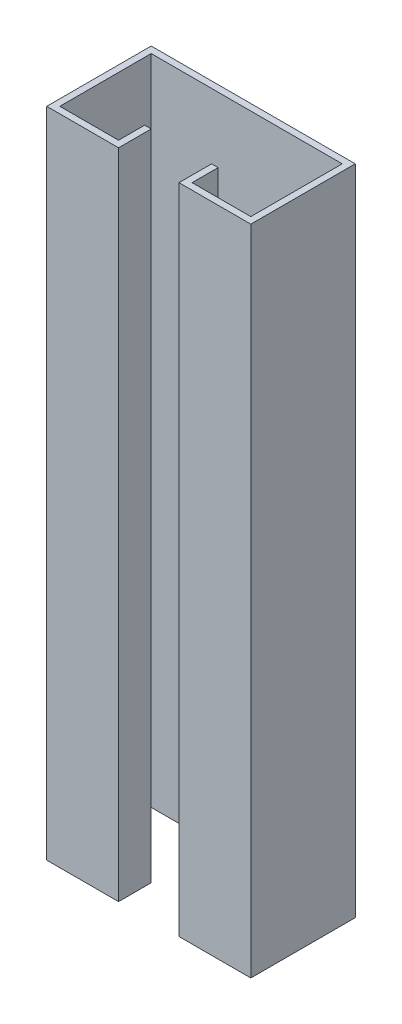
ISO-10303-21;
HEADER;
FILE_DESCRIPTION(('STEP AP214'),'2;1');
FILE_NAME('part.step','',(''),(''),'','','');
FILE_SCHEMA(('AUTOMOTIVE_DESIGN { 1 0 10303 214 1 1 1 1 }'));
ENDSEC;
DATA;
#1=APPLICATION_CONTEXT('core data for automotive mechanical design processes');
#2=APPLICATION_PROTOCOL_DEFINITION('international standard','automotive_design',2000,#1);
#3=PRODUCT_CONTEXT('',#1,'mechanical');
#4=PRODUCT('Part','Part','',(#3));
#5=PRODUCT_RELATED_PRODUCT_CATEGORY('part','',(#4));
#6=PRODUCT_DEFINITION_FORMATION('','',#4);
#7=PRODUCT_DEFINITION_CONTEXT('part definition',#1,'design');
#8=PRODUCT_DEFINITION('design','',#6,#7);
#9=PRODUCT_DEFINITION_SHAPE('','',#8);
#10=(LENGTH_UNIT() NAMED_UNIT(*) SI_UNIT(.MILLI.,.METRE.));
#11=(NAMED_UNIT(*) PLANE_ANGLE_UNIT() SI_UNIT($,.RADIAN.));
#12=(NAMED_UNIT(*) SI_UNIT($,.STERADIAN.) SOLID_ANGLE_UNIT());
#13=UNCERTAINTY_MEASURE_WITH_UNIT(LENGTH_MEASURE(1.E-05),#10,'distance_accuracy_value','');
#14=(GEOMETRIC_REPRESENTATION_CONTEXT(3) GLOBAL_UNCERTAINTY_ASSIGNED_CONTEXT((#13)) GLOBAL_UNIT_ASSIGNED_CONTEXT((#10,
#11,#12)) REPRESENTATION_CONTEXT('',''));
#15=CARTESIAN_POINT('',(0.,0.,0.));
#16=DIRECTION('',(0.,0.,1.));
#17=DIRECTION('',(1.,0.,0.));
#18=AXIS2_PLACEMENT_3D('',#15,#16,#17);
#19=CARTESIAN_POINT('',(198.483953118423,1270.,12.7));
#20=DIRECTION('',(0.,0.,-1.));
#21=DIRECTION('',(-1.,0.,0.));
#22=AXIS2_PLACEMENT_3D('',#19,#20,#21);
#23=PLANE('',#22);
#24=DIRECTION('',(1.,0.,0.));
#25=VECTOR('',#24,1.);
#26=CARTESIAN_POINT('',(198.483953118423,0.,12.7));
#27=LINE('',#26,#25);
#28=CARTESIAN_POINT('',(58.7839531184227,0.,12.7));
#29=VERTEX_POINT('',#28);
#30=CARTESIAN_POINT('',(198.483953118423,0.,12.7));
#31=VERTEX_POINT('',#30);
#32=EDGE_CURVE('E188',#29,#31,#27,.T.);
#33=ORIENTED_EDGE('',*,*,#32,.T.);
#34=DIRECTION('',(0.,-1.,0.));
#35=VECTOR('',#34,1.);
#36=CARTESIAN_POINT('',(198.483953118423,1270.,12.7));
#37=LINE('',#36,#35);
#38=CARTESIAN_POINT('',(198.483953118423,1270.,12.7));
#39=VERTEX_POINT('',#38);
#40=EDGE_CURVE('E11',#39,#31,#37,.T.);
#41=ORIENTED_EDGE('',*,*,#40,.F.);
#42=DIRECTION('',(1.,0.,0.));
#43=VECTOR('',#42,1.);
#44=CARTESIAN_POINT('',(198.483953118423,1270.,12.7));
#45=LINE('',#44,#43);
#46=CARTESIAN_POINT('',(58.7839531184227,1270.,12.7));
#47=VERTEX_POINT('',#46);
#48=EDGE_CURVE('E234',#47,#39,#45,.T.);
#49=ORIENTED_EDGE('',*,*,#48,.F.);
#50=DIRECTION('',(0.,-1.,0.));
#51=VECTOR('',#50,1.);
#52=CARTESIAN_POINT('',(58.7839531184227,1270.,12.7));
#53=LINE('',#52,#51);
#54=EDGE_CURVE('E184',#47,#29,#53,.T.);
#55=ORIENTED_EDGE('',*,*,#54,.T.);
#56=EDGE_LOOP('',(#33,#41,#49,#55));
#57=FACE_BOUND('',#56,.T.);
#58=ADVANCED_FACE('F39',(#57),#23,.F.);
#59=CARTESIAN_POINT('',(198.483953118423,1270.,-190.5));
#60=DIRECTION('',(-1.,0.,0.));
#61=DIRECTION('',(0.,0.,1.));
#62=AXIS2_PLACEMENT_3D('',#59,#60,#61);
#63=PLANE('',#62);
#64=DIRECTION('',(0.,0.,-1.));
#65=VECTOR('',#64,1.);
#66=CARTESIAN_POINT('',(198.483953118423,0.,-190.5));
#67=LINE('',#66,#65);
#68=CARTESIAN_POINT('',(198.483953118423,0.,-190.5));
#69=VERTEX_POINT('',#68);
#70=EDGE_CURVE('E192',#31,#69,#67,.T.);
#71=ORIENTED_EDGE('',*,*,#70,.T.);
#72=DIRECTION('',(0.,-1.,0.));
#73=VECTOR('',#72,1.);
#74=CARTESIAN_POINT('',(198.483953118423,1270.,-190.5));
#75=LINE('',#74,#73);
#76=CARTESIAN_POINT('',(198.483953118423,1270.,-190.5));
#77=VERTEX_POINT('',#76);
#78=EDGE_CURVE('E48',#77,#69,#75,.T.);
#79=ORIENTED_EDGE('',*,*,#78,.F.);
#80=DIRECTION('',(0.,0.,-1.));
#81=VECTOR('',#80,1.);
#82=CARTESIAN_POINT('',(198.483953118423,1270.,-190.5));
#83=LINE('',#82,#81);
#84=EDGE_CURVE('E123',#39,#77,#83,.T.);
#85=ORIENTED_EDGE('',*,*,#84,.F.);
#86=ORIENTED_EDGE('',*,*,#40,.T.);
#87=EDGE_LOOP('',(#71,#79,#85,#86));
#88=FACE_BOUND('',#87,.T.);
#89=ADVANCED_FACE('F356',(#88),#63,.F.);
#90=CARTESIAN_POINT('',(198.483953118423,1270.,-190.5));
#91=DIRECTION('',(0.,0.,1.));
#92=DIRECTION('',(1.,0.,0.));
#93=AXIS2_PLACEMENT_3D('',#90,#91,#92);
#94=PLANE('',#93);
#95=DIRECTION('',(-1.,0.,0.));
#96=VECTOR('',#95,1.);
#97=CARTESIAN_POINT('',(198.483953118423,0.,-190.5));
#98=LINE('',#97,#96);
#99=CARTESIAN_POINT('',(-198.483953118423,0.,-190.5));
#100=VERTEX_POINT('',#99);
#101=EDGE_CURVE('E195',#69,#100,#98,.T.);
#102=ORIENTED_EDGE('',*,*,#101,.T.);
#103=DIRECTION('',(0.,-1.,0.));
#104=VECTOR('',#103,1.);
#105=CARTESIAN_POINT('',(-198.483953118423,1270.,-190.5));
#106=LINE('',#105,#104);
#107=CARTESIAN_POINT('',(-198.483953118423,1270.,-190.5));
#108=VERTEX_POINT('',#107);
#109=EDGE_CURVE('E277',#108,#100,#106,.T.);
#110=ORIENTED_EDGE('',*,*,#109,.F.);
#111=DIRECTION('',(-1.,0.,0.));
#112=VECTOR('',#111,1.);
#113=CARTESIAN_POINT('',(198.483953118423,1270.,-190.5));
#114=LINE('',#113,#112);
#115=EDGE_CURVE('E287',#77,#108,#114,.T.);
#116=ORIENTED_EDGE('',*,*,#115,.F.);
#117=ORIENTED_EDGE('',*,*,#78,.T.);
#118=EDGE_LOOP('',(#102,#110,#116,#117));
#119=FACE_BOUND('',#118,.T.);
#120=ADVANCED_FACE('F285',(#119),#94,.F.);
#121=CARTESIAN_POINT('',(-198.483953118423,1270.,-190.5));
#122=DIRECTION('',(1.,0.,0.));
#123=DIRECTION('',(0.,0.,-1.));
#124=AXIS2_PLACEMENT_3D('',#121,#122,#123);
#125=PLANE('',#124);
#126=DIRECTION('',(0.,0.,1.));
#127=VECTOR('',#126,1.);
#128=CARTESIAN_POINT('',(-198.483953118423,0.,-190.5));
#129=LINE('',#128,#127);
#130=CARTESIAN_POINT('',(-198.483953118423,0.,12.7));
#131=VERTEX_POINT('',#130);
#132=EDGE_CURVE('E198',#100,#131,#129,.T.);
#133=ORIENTED_EDGE('',*,*,#132,.T.);
#134=DIRECTION('',(0.,-1.,0.));
#135=VECTOR('',#134,1.);
#136=CARTESIAN_POINT('',(-198.483953118423,1270.,12.7));
#137=LINE('',#136,#135);
#138=CARTESIAN_POINT('',(-198.483953118423,1270.,12.7));
#139=VERTEX_POINT('',#138);
#140=EDGE_CURVE('E273',#139,#131,#137,.T.);
#141=ORIENTED_EDGE('',*,*,#140,.F.);
#142=DIRECTION('',(0.,0.,1.));
#143=VECTOR('',#142,1.);
#144=CARTESIAN_POINT('',(-198.483953118423,1270.,-190.5));
#145=LINE('',#144,#143);
#146=EDGE_CURVE('E306',#108,#139,#145,.T.);
#147=ORIENTED_EDGE('',*,*,#146,.F.);
#148=ORIENTED_EDGE('',*,*,#109,.T.);
#149=EDGE_LOOP('',(#133,#141,#147,#148));
#150=FACE_BOUND('',#149,.T.);
#151=ADVANCED_FACE('F296',(#150),#125,.F.);
#152=CARTESIAN_POINT('',(-198.483953118423,1270.,12.7));
#153=DIRECTION('',(0.,0.,-1.));
#154=DIRECTION('',(-1.,0.,0.));
#155=AXIS2_PLACEMENT_3D('',#152,#153,#154);
#156=PLANE('',#155);
#157=DIRECTION('',(1.,0.,0.));
#158=VECTOR('',#157,1.);
#159=CARTESIAN_POINT('',(-198.483953118423,0.,12.7));
#160=LINE('',#159,#158);
#161=CARTESIAN_POINT('',(-58.7839531184227,0.,12.7));
#162=VERTEX_POINT('',#161);
#163=EDGE_CURVE('E201',#131,#162,#160,.T.);
#164=ORIENTED_EDGE('',*,*,#163,.T.);
#165=DIRECTION('',(0.,-1.,0.));
#166=VECTOR('',#165,1.);
#167=CARTESIAN_POINT('',(-58.7839531184227,1270.,12.7));
#168=LINE('',#167,#166);
#169=CARTESIAN_POINT('',(-58.7839531184227,1270.,12.7));
#170=VERTEX_POINT('',#169);
#171=EDGE_CURVE('E269',#170,#162,#168,.T.);
#172=ORIENTED_EDGE('',*,*,#171,.F.);
#173=DIRECTION('',(1.,0.,0.));
#174=VECTOR('',#173,1.);
#175=CARTESIAN_POINT('',(-198.483953118423,1270.,12.7));
#176=LINE('',#175,#174);
#177=EDGE_CURVE('E302',#139,#170,#176,.T.);
#178=ORIENTED_EDGE('',*,*,#177,.F.);
#179=ORIENTED_EDGE('',*,*,#140,.T.);
#180=EDGE_LOOP('',(#164,#172,#178,#179));
#181=FACE_BOUND('',#180,.T.);
#182=ADVANCED_FACE('F300',(#181),#156,.F.);
#183=CARTESIAN_POINT('',(-58.7839531184227,1270.,12.7));
#184=DIRECTION('',(-1.,0.,0.));
#185=DIRECTION('',(0.,0.,1.));
#186=AXIS2_PLACEMENT_3D('',#183,#184,#185);
#187=PLANE('',#186);
#188=DIRECTION('',(0.,0.,-1.));
#189=VECTOR('',#188,1.);
#190=CARTESIAN_POINT('',(-58.7839531184227,0.,12.7));
#191=LINE('',#190,#189);
#192=CARTESIAN_POINT('',(-58.7839531184227,0.,-50.8));
#193=VERTEX_POINT('',#192);
#194=EDGE_CURVE('E204',#162,#193,#191,.T.);
#195=ORIENTED_EDGE('',*,*,#194,.T.);
#196=DIRECTION('',(0.,-1.,0.));
#197=VECTOR('',#196,1.);
#198=CARTESIAN_POINT('',(-58.7839531184227,1270.,-50.8));
#199=LINE('',#198,#197);
#200=CARTESIAN_POINT('',(-58.7839531184227,1270.,-50.8));
#201=VERTEX_POINT('',#200);
#202=EDGE_CURVE('E265',#201,#193,#199,.T.);
#203=ORIENTED_EDGE('',*,*,#202,.F.);
#204=DIRECTION('',(0.,0.,-1.));
#205=VECTOR('',#204,1.);
#206=CARTESIAN_POINT('',(-58.7839531184227,1270.,12.7));
#207=LINE('',#206,#205);
#208=EDGE_CURVE('E305',#170,#201,#207,.T.);
#209=ORIENTED_EDGE('',*,*,#208,.F.);
#210=ORIENTED_EDGE('',*,*,#171,.T.);
#211=EDGE_LOOP('',(#195,#203,#209,#210));
#212=FACE_BOUND('',#211,.T.);
#213=ADVANCED_FACE('F369',(#212),#187,.F.);
#214=CARTESIAN_POINT('',(-71.4839531184227,1270.,-50.8));
#215=DIRECTION('',(0.,0.,1.));
#216=DIRECTION('',(1.,0.,0.));
#217=AXIS2_PLACEMENT_3D('',#214,#215,#216);
#218=PLANE('',#217);
#219=DIRECTION('',(-1.,0.,0.));
#220=VECTOR('',#219,1.);
#221=CARTESIAN_POINT('',(-71.4839531184227,0.,-50.8));
#222=LINE('',#221,#220);
#223=CARTESIAN_POINT('',(-71.4839531184227,0.,-50.8));
#224=VERTEX_POINT('',#223);
#225=EDGE_CURVE('E207',#193,#224,#222,.T.);
#226=ORIENTED_EDGE('',*,*,#225,.T.);
#227=DIRECTION('',(0.,-1.,0.));
#228=VECTOR('',#227,1.);
#229=CARTESIAN_POINT('',(-71.4839531184227,1270.,-50.8));
#230=LINE('',#229,#228);
#231=CARTESIAN_POINT('',(-71.4839531184227,1270.,-50.8));
#232=VERTEX_POINT('',#231);
#233=EDGE_CURVE('E261',#232,#224,#230,.T.);
#234=ORIENTED_EDGE('',*,*,#233,.F.);
#235=DIRECTION('',(-1.,0.,0.));
#236=VECTOR('',#235,1.);
#237=CARTESIAN_POINT('',(-71.4839531184227,1270.,-50.8));
#238=LINE('',#237,#236);
#239=EDGE_CURVE('E310',#201,#232,#238,.T.);
#240=ORIENTED_EDGE('',*,*,#239,.F.);
#241=ORIENTED_EDGE('',*,*,#202,.T.);
#242=EDGE_LOOP('',(#226,#234,#240,#241));
#243=FACE_BOUND('',#242,.T.);
#244=ADVANCED_FACE('F372',(#243),#218,.F.);
#245=CARTESIAN_POINT('',(-71.4839531184227,1270.,0.));
#246=DIRECTION('',(1.,0.,0.));
#247=DIRECTION('',(0.,0.,-1.));
#248=AXIS2_PLACEMENT_3D('',#245,#246,#247);
#249=PLANE('',#248);
#250=DIRECTION('',(0.,0.,1.));
#251=VECTOR('',#250,1.);
#252=CARTESIAN_POINT('',(-71.4839531184227,0.,0.));
#253=LINE('',#252,#251);
#254=CARTESIAN_POINT('',(-71.4839531184227,0.,0.));
#255=VERTEX_POINT('',#254);
#256=EDGE_CURVE('E210',#224,#255,#253,.T.);
#257=ORIENTED_EDGE('',*,*,#256,.T.);
#258=DIRECTION('',(0.,-1.,0.));
#259=VECTOR('',#258,1.);
#260=CARTESIAN_POINT('',(-71.4839531184227,1270.,0.));
#261=LINE('',#260,#259);
#262=CARTESIAN_POINT('',(-71.4839531184227,1270.,0.));
#263=VERTEX_POINT('',#262);
#264=EDGE_CURVE('E257',#263,#255,#261,.T.);
#265=ORIENTED_EDGE('',*,*,#264,.F.);
#266=DIRECTION('',(0.,0.,1.));
#267=VECTOR('',#266,1.);
#268=CARTESIAN_POINT('',(-71.4839531184227,1270.,0.));
#269=LINE('',#268,#267);
#270=EDGE_CURVE('E317',#232,#263,#269,.T.);
#271=ORIENTED_EDGE('',*,*,#270,.F.);
#272=ORIENTED_EDGE('',*,*,#233,.T.);
#273=EDGE_LOOP('',(#257,#265,#271,#272));
#274=FACE_BOUND('',#273,.T.);
#275=ADVANCED_FACE('F376',(#274),#249,.F.);
#276=CARTESIAN_POINT('',(-185.783953118423,1270.,0.));
#277=DIRECTION('',(0.,0.,1.));
#278=DIRECTION('',(1.,0.,0.));
#279=AXIS2_PLACEMENT_3D('',#276,#277,#278);
#280=PLANE('',#279);
#281=DIRECTION('',(-1.,0.,0.));
#282=VECTOR('',#281,1.);
#283=CARTESIAN_POINT('',(-185.783953118423,0.,0.));
#284=LINE('',#283,#282);
#285=CARTESIAN_POINT('',(-185.783953118423,0.,0.));
#286=VERTEX_POINT('',#285);
#287=EDGE_CURVE('E213',#255,#286,#284,.T.);
#288=ORIENTED_EDGE('',*,*,#287,.T.);
#289=DIRECTION('',(0.,-1.,0.));
#290=VECTOR('',#289,1.);
#291=CARTESIAN_POINT('',(-185.783953118423,1270.,0.));
#292=LINE('',#291,#290);
#293=CARTESIAN_POINT('',(-185.783953118423,1270.,0.));
#294=VERTEX_POINT('',#293);
#295=EDGE_CURVE('E253',#294,#286,#292,.T.);
#296=ORIENTED_EDGE('',*,*,#295,.F.);
#297=DIRECTION('',(-1.,0.,0.));
#298=VECTOR('',#297,1.);
#299=CARTESIAN_POINT('',(-185.783953118423,1270.,0.));
#300=LINE('',#299,#298);
#301=EDGE_CURVE('E320',#263,#294,#300,.T.);
#302=ORIENTED_EDGE('',*,*,#301,.F.);
#303=ORIENTED_EDGE('',*,*,#264,.T.);
#304=EDGE_LOOP('',(#288,#296,#302,#303));
#305=FACE_BOUND('',#304,.T.);
#306=ADVANCED_FACE('F380',(#305),#280,.F.);
#307=CARTESIAN_POINT('',(-185.783953118423,1270.,-177.8));
#308=DIRECTION('',(-1.,0.,0.));
#309=DIRECTION('',(0.,0.,1.));
#310=AXIS2_PLACEMENT_3D('',#307,#308,#309);
#311=PLANE('',#310);
#312=DIRECTION('',(0.,0.,-1.));
#313=VECTOR('',#312,1.);
#314=CARTESIAN_POINT('',(-185.783953118423,0.,-177.8));
#315=LINE('',#314,#313);
#316=CARTESIAN_POINT('',(-185.783953118423,0.,-177.8));
#317=VERTEX_POINT('',#316);
#318=EDGE_CURVE('E216',#286,#317,#315,.T.);
#319=ORIENTED_EDGE('',*,*,#318,.T.);
#320=DIRECTION('',(0.,-1.,0.));
#321=VECTOR('',#320,1.);
#322=CARTESIAN_POINT('',(-185.783953118423,1270.,-177.8));
#323=LINE('',#322,#321);
#324=CARTESIAN_POINT('',(-185.783953118423,1270.,-177.8));
#325=VERTEX_POINT('',#324);
#326=EDGE_CURVE('E249',#325,#317,#323,.T.);
#327=ORIENTED_EDGE('',*,*,#326,.F.);
#328=DIRECTION('',(0.,0.,-1.));
#329=VECTOR('',#328,1.);
#330=CARTESIAN_POINT('',(-185.783953118423,1270.,-177.8));
#331=LINE('',#330,#329);
#332=EDGE_CURVE('E323',#294,#325,#331,.T.);
#333=ORIENTED_EDGE('',*,*,#332,.F.);
#334=ORIENTED_EDGE('',*,*,#295,.T.);
#335=EDGE_LOOP('',(#319,#327,#333,#334));
#336=FACE_BOUND('',#335,.T.);
#337=ADVANCED_FACE('F384',(#336),#311,.F.);
#338=CARTESIAN_POINT('',(185.783953118423,1270.,-177.8));
#339=DIRECTION('',(0.,0.,-1.));
#340=DIRECTION('',(-1.,0.,0.));
#341=AXIS2_PLACEMENT_3D('',#338,#339,#340);
#342=PLANE('',#341);
#343=DIRECTION('',(1.,0.,0.));
#344=VECTOR('',#343,1.);
#345=CARTESIAN_POINT('',(185.783953118423,0.,-177.8));
#346=LINE('',#345,#344);
#347=CARTESIAN_POINT('',(185.783953118423,0.,-177.8));
#348=VERTEX_POINT('',#347);
#349=EDGE_CURVE('E219',#317,#348,#346,.T.);
#350=ORIENTED_EDGE('',*,*,#349,.T.);
#351=DIRECTION('',(0.,-1.,0.));
#352=VECTOR('',#351,1.);
#353=CARTESIAN_POINT('',(185.783953118423,1270.,-177.8));
#354=LINE('',#353,#352);
#355=CARTESIAN_POINT('',(185.783953118423,1270.,-177.8));
#356=VERTEX_POINT('',#355);
#357=EDGE_CURVE('E245',#356,#348,#354,.T.);
#358=ORIENTED_EDGE('',*,*,#357,.F.);
#359=DIRECTION('',(1.,0.,0.));
#360=VECTOR('',#359,1.);
#361=CARTESIAN_POINT('',(185.783953118423,1270.,-177.8));
#362=LINE('',#361,#360);
#363=EDGE_CURVE('E326',#325,#356,#362,.T.);
#364=ORIENTED_EDGE('',*,*,#363,.F.);
#365=ORIENTED_EDGE('',*,*,#326,.T.);
#366=EDGE_LOOP('',(#350,#358,#364,#365));
#367=FACE_BOUND('',#366,.T.);
#368=ADVANCED_FACE('F388',(#367),#342,.F.);
#369=CARTESIAN_POINT('',(185.783953118423,1270.,-177.8));
#370=DIRECTION('',(1.,0.,0.));
#371=DIRECTION('',(0.,0.,-1.));
#372=AXIS2_PLACEMENT_3D('',#369,#370,#371);
#373=PLANE('',#372);
#374=DIRECTION('',(0.,0.,1.));
#375=VECTOR('',#374,1.);
#376=CARTESIAN_POINT('',(185.783953118423,0.,-177.8));
#377=LINE('',#376,#375);
#378=CARTESIAN_POINT('',(185.783953118423,0.,0.));
#379=VERTEX_POINT('',#378);
#380=EDGE_CURVE('E222',#348,#379,#377,.T.);
#381=ORIENTED_EDGE('',*,*,#380,.T.);
#382=DIRECTION('',(0.,-1.,0.));
#383=VECTOR('',#382,1.);
#384=CARTESIAN_POINT('',(185.783953118423,1270.,0.));
#385=LINE('',#384,#383);
#386=CARTESIAN_POINT('',(185.783953118423,1270.,0.));
#387=VERTEX_POINT('',#386);
#388=EDGE_CURVE('E241',#387,#379,#385,.T.);
#389=ORIENTED_EDGE('',*,*,#388,.F.);
#390=DIRECTION('',(0.,0.,1.));
#391=VECTOR('',#390,1.);
#392=CARTESIAN_POINT('',(185.783953118423,1270.,-177.8));
#393=LINE('',#392,#391);
#394=EDGE_CURVE('E329',#356,#387,#393,.T.);
#395=ORIENTED_EDGE('',*,*,#394,.F.);
#396=ORIENTED_EDGE('',*,*,#357,.T.);
#397=EDGE_LOOP('',(#381,#389,#395,#396));
#398=FACE_BOUND('',#397,.T.);
#399=ADVANCED_FACE('F337',(#398),#373,.F.);
#400=CARTESIAN_POINT('',(185.783953118423,1270.,0.));
#401=DIRECTION('',(0.,0.,1.));
#402=DIRECTION('',(1.,0.,0.));
#403=AXIS2_PLACEMENT_3D('',#400,#401,#402);
#404=PLANE('',#403);
#405=DIRECTION('',(-1.,0.,0.));
#406=VECTOR('',#405,1.);
#407=CARTESIAN_POINT('',(185.783953118423,0.,0.));
#408=LINE('',#407,#406);
#409=CARTESIAN_POINT('',(71.4839531184227,0.,0.));
#410=VERTEX_POINT('',#409);
#411=EDGE_CURVE('E225',#379,#410,#408,.T.);
#412=ORIENTED_EDGE('',*,*,#411,.T.);
#413=DIRECTION('',(0.,-1.,0.));
#414=VECTOR('',#413,1.);
#415=CARTESIAN_POINT('',(71.4839531184227,1270.,0.));
#416=LINE('',#415,#414);
#417=CARTESIAN_POINT('',(71.4839531184227,1270.,0.));
#418=VERTEX_POINT('',#417);
#419=EDGE_CURVE('E177',#418,#410,#416,.T.);
#420=ORIENTED_EDGE('',*,*,#419,.F.);
#421=DIRECTION('',(-1.,0.,0.));
#422=VECTOR('',#421,1.);
#423=CARTESIAN_POINT('',(185.783953118423,1270.,0.));
#424=LINE('',#423,#422);
#425=EDGE_CURVE('E166',#387,#418,#424,.T.);
#426=ORIENTED_EDGE('',*,*,#425,.F.);
#427=ORIENTED_EDGE('',*,*,#388,.T.);
#428=EDGE_LOOP('',(#412,#420,#426,#427));
#429=FACE_BOUND('',#428,.T.);
#430=ADVANCED_FACE('F341',(#429),#404,.F.);
#431=CARTESIAN_POINT('',(71.4839531184227,1270.,0.));
#432=DIRECTION('',(-1.,0.,0.));
#433=DIRECTION('',(0.,0.,1.));
#434=AXIS2_PLACEMENT_3D('',#431,#432,#433);
#435=PLANE('',#434);
#436=DIRECTION('',(0.,0.,-1.));
#437=VECTOR('',#436,1.);
#438=CARTESIAN_POINT('',(71.4839531184227,0.,0.));
#439=LINE('',#438,#437);
#440=CARTESIAN_POINT('',(71.4839531184227,0.,-50.8));
#441=VERTEX_POINT('',#440);
#442=EDGE_CURVE('E175',#410,#441,#439,.T.);
#443=ORIENTED_EDGE('',*,*,#442,.T.);
#444=DIRECTION('',(0.,-1.,0.));
#445=VECTOR('',#444,1.);
#446=CARTESIAN_POINT('',(71.4839531184227,1270.,-50.8));
#447=LINE('',#446,#445);
#448=CARTESIAN_POINT('',(71.4839531184227,1270.,-50.8));
#449=VERTEX_POINT('',#448);
#450=EDGE_CURVE('E172',#449,#441,#447,.T.);
#451=ORIENTED_EDGE('',*,*,#450,.F.);
#452=DIRECTION('',(0.,0.,-1.));
#453=VECTOR('',#452,1.);
#454=CARTESIAN_POINT('',(71.4839531184227,1270.,0.));
#455=LINE('',#454,#453);
#456=EDGE_CURVE('E160',#418,#449,#455,.T.);
#457=ORIENTED_EDGE('',*,*,#456,.F.);
#458=ORIENTED_EDGE('',*,*,#419,.T.);
#459=EDGE_LOOP('',(#443,#451,#457,#458));
#460=FACE_BOUND('',#459,.T.);
#461=ADVANCED_FACE('F173',(#460),#435,.F.);
#462=CARTESIAN_POINT('',(58.7839531184227,1270.,-50.8));
#463=DIRECTION('',(0.,0.,1.));
#464=DIRECTION('',(1.,0.,0.));
#465=AXIS2_PLACEMENT_3D('',#462,#463,#464);
#466=PLANE('',#465);
#467=DIRECTION('',(-1.,0.,0.));
#468=VECTOR('',#467,1.);
#469=CARTESIAN_POINT('',(58.7839531184227,0.,-50.8));
#470=LINE('',#469,#468);
#471=CARTESIAN_POINT('',(58.7839531184227,0.,-50.8));
#472=VERTEX_POINT('',#471);
#473=EDGE_CURVE('E109',#441,#472,#470,.T.);
#474=ORIENTED_EDGE('',*,*,#473,.T.);
#475=DIRECTION('',(0.,-1.,0.));
#476=VECTOR('',#475,1.);
#477=CARTESIAN_POINT('',(58.7839531184227,1270.,-50.8));
#478=LINE('',#477,#476);
#479=CARTESIAN_POINT('',(58.7839531184227,1270.,-50.8));
#480=VERTEX_POINT('',#479);
#481=EDGE_CURVE('E178',#480,#472,#478,.T.);
#482=ORIENTED_EDGE('',*,*,#481,.F.);
#483=DIRECTION('',(-1.,0.,0.));
#484=VECTOR('',#483,1.);
#485=CARTESIAN_POINT('',(58.7839531184227,1270.,-50.8));
#486=LINE('',#485,#484);
#487=EDGE_CURVE('E164',#449,#480,#486,.T.);
#488=ORIENTED_EDGE('',*,*,#487,.F.);
#489=ORIENTED_EDGE('',*,*,#450,.T.);
#490=EDGE_LOOP('',(#474,#482,#488,#489));
#491=FACE_BOUND('',#490,.T.);
#492=ADVANCED_FACE('F180',(#491),#466,.F.);
#493=CARTESIAN_POINT('',(58.7839531184227,1270.,12.7));
#494=DIRECTION('',(1.,0.,0.));
#495=DIRECTION('',(0.,0.,-1.));
#496=AXIS2_PLACEMENT_3D('',#493,#494,#495);
#497=PLANE('',#496);
#498=DIRECTION('',(0.,0.,1.));
#499=VECTOR('',#498,1.);
#500=CARTESIAN_POINT('',(58.7839531184227,0.,12.7));
#501=LINE('',#500,#499);
#502=EDGE_CURVE('E115',#472,#29,#501,.T.);
#503=ORIENTED_EDGE('',*,*,#502,.T.);
#504=ORIENTED_EDGE('',*,*,#54,.F.);
#505=DIRECTION('',(0.,0.,1.));
#506=VECTOR('',#505,1.);
#507=CARTESIAN_POINT('',(58.7839531184227,1270.,12.7));
#508=LINE('',#507,#506);
#509=EDGE_CURVE('E56',#480,#47,#508,.T.);
#510=ORIENTED_EDGE('',*,*,#509,.F.);
#511=ORIENTED_EDGE('',*,*,#481,.T.);
#512=EDGE_LOOP('',(#503,#504,#510,#511));
#513=FACE_BOUND('',#512,.T.);
#514=ADVANCED_FACE('F345',(#513),#497,.F.);
#515=CARTESIAN_POINT('',(0.,1270.,0.));
#516=DIRECTION('',(0.,-1.,0.));
#517=DIRECTION('',(0.,0.,-1.));
#518=AXIS2_PLACEMENT_3D('',#515,#516,#517);
#519=PLANE('',#518);
#520=ORIENTED_EDGE('',*,*,#48,.T.);
#521=ORIENTED_EDGE('',*,*,#84,.T.);
#522=ORIENTED_EDGE('',*,*,#115,.T.);
#523=ORIENTED_EDGE('',*,*,#146,.T.);
#524=ORIENTED_EDGE('',*,*,#177,.T.);
#525=ORIENTED_EDGE('',*,*,#208,.T.);
#526=ORIENTED_EDGE('',*,*,#239,.T.);
#527=ORIENTED_EDGE('',*,*,#270,.T.);
#528=ORIENTED_EDGE('',*,*,#301,.T.);
#529=ORIENTED_EDGE('',*,*,#332,.T.);
#530=ORIENTED_EDGE('',*,*,#363,.T.);
#531=ORIENTED_EDGE('',*,*,#394,.T.);
#532=ORIENTED_EDGE('',*,*,#425,.T.);
#533=ORIENTED_EDGE('',*,*,#456,.T.);
#534=ORIENTED_EDGE('',*,*,#487,.T.);
#535=ORIENTED_EDGE('',*,*,#509,.T.);
#536=EDGE_LOOP('',(#520,#521,#522,#523,#524,#525,#526,#527,#528,#529,#530,#531,#532,#533,#534,#535));
#537=FACE_BOUND('',#536,.T.);
#538=ADVANCED_FACE('F162',(#537),#519,.F.);
#539=CARTESIAN_POINT('',(0.,0.,0.));
#540=DIRECTION('',(0.,-1.,0.));
#541=DIRECTION('',(0.,0.,-1.));
#542=AXIS2_PLACEMENT_3D('',#539,#540,#541);
#543=PLANE('',#542);
#544=ORIENTED_EDGE('',*,*,#32,.F.);
#545=ORIENTED_EDGE('',*,*,#502,.F.);
#546=ORIENTED_EDGE('',*,*,#473,.F.);
#547=ORIENTED_EDGE('',*,*,#442,.F.);
#548=ORIENTED_EDGE('',*,*,#411,.F.);
#549=ORIENTED_EDGE('',*,*,#380,.F.);
#550=ORIENTED_EDGE('',*,*,#349,.F.);
#551=ORIENTED_EDGE('',*,*,#318,.F.);
#552=ORIENTED_EDGE('',*,*,#287,.F.);
#553=ORIENTED_EDGE('',*,*,#256,.F.);
#554=ORIENTED_EDGE('',*,*,#225,.F.);
#555=ORIENTED_EDGE('',*,*,#194,.F.);
#556=ORIENTED_EDGE('',*,*,#163,.F.);
#557=ORIENTED_EDGE('',*,*,#132,.F.);
#558=ORIENTED_EDGE('',*,*,#101,.F.);
#559=ORIENTED_EDGE('',*,*,#70,.F.);
#560=EDGE_LOOP('',(#544,#545,#546,#547,#548,#549,#550,#551,#552,#553,#554,#555,#556,#557,#558,#559));
#561=FACE_BOUND('',#560,.T.);
#562=ADVANCED_FACE('F291',(#561),#543,.T.);
#563=CLOSED_SHELL('',(#58,#89,#120,#151,#182,#213,#244,#275,#306,#337,#368,#399,#430,#461,#492,
#514,#538,#562));
#564=MANIFOLD_SOLID_BREP('B2',#563);
#565=ADVANCED_BREP_SHAPE_REPRESENTATION('',(#18,#564),#14);
#566=SHAPE_DEFINITION_REPRESENTATION(#9,#565);
ENDSEC;
END-ISO-10303-21;
